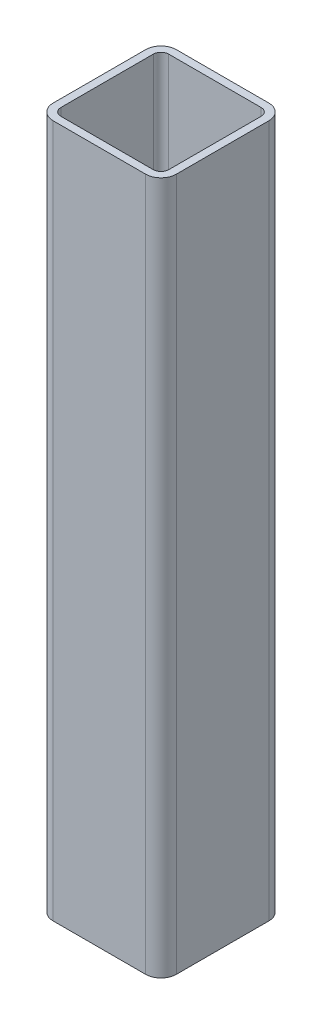
ISO-10303-21;
HEADER;
FILE_DESCRIPTION(('STEP AP214'),'2;1');
FILE_NAME('part.step','',(''),(''),'','','');
FILE_SCHEMA(('AUTOMOTIVE_DESIGN { 1 0 10303 214 1 1 1 1 }'));
ENDSEC;
DATA;
#1=APPLICATION_CONTEXT('core data for automotive mechanical design processes');
#2=APPLICATION_PROTOCOL_DEFINITION('international standard','automotive_design',2000,#1);
#3=PRODUCT_CONTEXT('',#1,'mechanical');
#4=PRODUCT('Part','Part','',(#3));
#5=PRODUCT_RELATED_PRODUCT_CATEGORY('part','',(#4));
#6=PRODUCT_DEFINITION_FORMATION('','',#4);
#7=PRODUCT_DEFINITION_CONTEXT('part definition',#1,'design');
#8=PRODUCT_DEFINITION('design','',#6,#7);
#9=PRODUCT_DEFINITION_SHAPE('','',#8);
#10=(LENGTH_UNIT() NAMED_UNIT(*) SI_UNIT(.MILLI.,.METRE.));
#11=(NAMED_UNIT(*) PLANE_ANGLE_UNIT() SI_UNIT($,.RADIAN.));
#12=(NAMED_UNIT(*) SI_UNIT($,.STERADIAN.) SOLID_ANGLE_UNIT());
#13=UNCERTAINTY_MEASURE_WITH_UNIT(LENGTH_MEASURE(1.E-05),#10,'distance_accuracy_value','');
#14=(GEOMETRIC_REPRESENTATION_CONTEXT(3) GLOBAL_UNCERTAINTY_ASSIGNED_CONTEXT((#13)) GLOBAL_UNIT_ASSIGNED_CONTEXT((#10,
#11,#12)) REPRESENTATION_CONTEXT('',''));
#15=CARTESIAN_POINT('',(0.,0.,0.));
#16=DIRECTION('',(0.,0.,1.));
#17=DIRECTION('',(1.,0.,0.));
#18=AXIS2_PLACEMENT_3D('',#15,#16,#17);
#19=CARTESIAN_POINT('',(70.,450.,-10.));
#20=DIRECTION('',(0.,1.,0.));
#21=DIRECTION('',(0.,0.,1.));
#22=AXIS2_PLACEMENT_3D('',#19,#20,#21);
#23=PLANE('',#22);
#24=CARTESIAN_POINT('',(70.,450.,-10.));
#25=DIRECTION('',(0.,1.,0.));
#26=DIRECTION('',(0.,0.,1.));
#27=AXIS2_PLACEMENT_3D('',#24,#25,#26);
#28=CIRCLE('',#27,10.);
#29=CARTESIAN_POINT('',(69.9999999999999,450.,0.));
#30=VERTEX_POINT('',#29);
#31=CARTESIAN_POINT('',(80.,450.,-10.0000000000001));
#32=VERTEX_POINT('',#31);
#33=EDGE_CURVE('E212',#30,#32,#28,.T.);
#34=ORIENTED_EDGE('',*,*,#33,.T.);
#35=DIRECTION('',(0.,0.,-1.));
#36=VECTOR('',#35,1.);
#37=CARTESIAN_POINT('',(80.,450.,-10.0000000000001));
#38=LINE('',#37,#36);
#39=CARTESIAN_POINT('',(80.,450.,-69.9999999999999));
#40=VERTEX_POINT('',#39);
#41=EDGE_CURVE('E215',#32,#40,#38,.T.);
#42=ORIENTED_EDGE('',*,*,#41,.T.);
#43=CARTESIAN_POINT('',(70.,450.,-70.));
#44=DIRECTION('',(0.,1.,0.));
#45=DIRECTION('',(0.,0.,1.));
#46=AXIS2_PLACEMENT_3D('',#43,#44,#45);
#47=CIRCLE('',#46,10.);
#48=CARTESIAN_POINT('',(69.9999999999999,450.,-80.));
#49=VERTEX_POINT('',#48);
#50=EDGE_CURVE('E218',#40,#49,#47,.T.);
#51=ORIENTED_EDGE('',*,*,#50,.T.);
#52=DIRECTION('',(-1.,0.,0.));
#53=VECTOR('',#52,1.);
#54=CARTESIAN_POINT('',(10.0000000000001,450.,-80.));
#55=LINE('',#54,#53);
#56=CARTESIAN_POINT('',(10.0000000000001,450.,-80.));
#57=VERTEX_POINT('',#56);
#58=EDGE_CURVE('E220',#49,#57,#55,.T.);
#59=ORIENTED_EDGE('',*,*,#58,.T.);
#60=CARTESIAN_POINT('',(10.,450.,-70.));
#61=DIRECTION('',(0.,1.,0.));
#62=DIRECTION('',(0.,0.,1.));
#63=AXIS2_PLACEMENT_3D('',#60,#61,#62);
#64=CIRCLE('',#63,10.);
#65=CARTESIAN_POINT('',(0.,450.,-69.9999999999999));
#66=VERTEX_POINT('',#65);
#67=EDGE_CURVE('E222',#57,#66,#64,.T.);
#68=ORIENTED_EDGE('',*,*,#67,.T.);
#69=DIRECTION('',(0.,0.,1.));
#70=VECTOR('',#69,1.);
#71=CARTESIAN_POINT('',(0.,450.,-10.0000000000001));
#72=LINE('',#71,#70);
#73=CARTESIAN_POINT('',(0.,450.,-10.0000000000001));
#74=VERTEX_POINT('',#73);
#75=EDGE_CURVE('E224',#66,#74,#72,.T.);
#76=ORIENTED_EDGE('',*,*,#75,.T.);
#77=CARTESIAN_POINT('',(10.,450.,-10.));
#78=DIRECTION('',(0.,1.,0.));
#79=DIRECTION('',(0.,0.,1.));
#80=AXIS2_PLACEMENT_3D('',#77,#78,#79);
#81=CIRCLE('',#80,10.);
#82=CARTESIAN_POINT('',(10.0000000000001,450.,0.));
#83=VERTEX_POINT('',#82);
#84=EDGE_CURVE('E226',#74,#83,#81,.T.);
#85=ORIENTED_EDGE('',*,*,#84,.T.);
#86=DIRECTION('',(1.,0.,0.));
#87=VECTOR('',#86,1.);
#88=CARTESIAN_POINT('',(10.0000000000001,450.,0.));
#89=LINE('',#88,#87);
#90=EDGE_CURVE('E228',#83,#30,#89,.T.);
#91=ORIENTED_EDGE('',*,*,#90,.T.);
#92=EDGE_LOOP('',(#34,#42,#51,#59,#68,#76,#85,#91));
#93=FACE_BOUND('',#92,.T.);
#94=DIRECTION('',(1.,0.,0.));
#95=VECTOR('',#94,1.);
#96=CARTESIAN_POINT('',(10.0000000000001,450.,-5.));
#97=LINE('',#96,#95);
#98=CARTESIAN_POINT('',(10.0000000000001,450.,-5.));
#99=VERTEX_POINT('',#98);
#100=CARTESIAN_POINT('',(70.,450.,-5.00000000000001));
#101=VERTEX_POINT('',#100);
#102=EDGE_CURVE('E155',#99,#101,#97,.T.);
#103=ORIENTED_EDGE('',*,*,#102,.F.);
#104=CARTESIAN_POINT('',(10.,450.,-10.));
#105=DIRECTION('',(0.,1.,0.));
#106=DIRECTION('',(0.,0.,1.));
#107=AXIS2_PLACEMENT_3D('',#104,#105,#106);
#108=CIRCLE('',#107,5.);
#109=CARTESIAN_POINT('',(5.,450.,-10.0000000000001));
#110=VERTEX_POINT('',#109);
#111=EDGE_CURVE('E147',#110,#99,#108,.T.);
#112=ORIENTED_EDGE('',*,*,#111,.F.);
#113=DIRECTION('',(0.,0.,1.));
#114=VECTOR('',#113,1.);
#115=CARTESIAN_POINT('',(5.,450.,-10.0000000000001));
#116=LINE('',#115,#114);
#117=CARTESIAN_POINT('',(5.,450.,-69.9999999999999));
#118=VERTEX_POINT('',#117);
#119=EDGE_CURVE('E180',#118,#110,#116,.T.);
#120=ORIENTED_EDGE('',*,*,#119,.F.);
#121=CARTESIAN_POINT('',(10.,450.,-70.));
#122=DIRECTION('',(0.,1.,0.));
#123=DIRECTION('',(0.,0.,1.));
#124=AXIS2_PLACEMENT_3D('',#121,#122,#123);
#125=CIRCLE('',#124,5.);
#126=CARTESIAN_POINT('',(10.,450.,-75.));
#127=VERTEX_POINT('',#126);
#128=EDGE_CURVE('E178',#127,#118,#125,.T.);
#129=ORIENTED_EDGE('',*,*,#128,.F.);
#130=DIRECTION('',(-1.,0.,0.));
#131=VECTOR('',#130,1.);
#132=CARTESIAN_POINT('',(10.,450.,-75.));
#133=LINE('',#132,#131);
#134=CARTESIAN_POINT('',(69.9999999999999,450.,-75.));
#135=VERTEX_POINT('',#134);
#136=EDGE_CURVE('E176',#135,#127,#133,.T.);
#137=ORIENTED_EDGE('',*,*,#136,.F.);
#138=CARTESIAN_POINT('',(70.,450.,-70.));
#139=DIRECTION('',(0.,1.,0.));
#140=DIRECTION('',(0.,0.,1.));
#141=AXIS2_PLACEMENT_3D('',#138,#139,#140);
#142=CIRCLE('',#141,5.00000000000001);
#143=CARTESIAN_POINT('',(75.,450.,-70.));
#144=VERTEX_POINT('',#143);
#145=EDGE_CURVE('E174',#144,#135,#142,.T.);
#146=ORIENTED_EDGE('',*,*,#145,.F.);
#147=DIRECTION('',(0.,0.,-1.));
#148=VECTOR('',#147,1.);
#149=CARTESIAN_POINT('',(75.,450.,-10.0000000000001));
#150=LINE('',#149,#148);
#151=CARTESIAN_POINT('',(75.,450.,-10.0000000000001));
#152=VERTEX_POINT('',#151);
#153=EDGE_CURVE('E170',#152,#144,#150,.T.);
#154=ORIENTED_EDGE('',*,*,#153,.F.);
#155=CARTESIAN_POINT('',(70.,450.,-10.));
#156=DIRECTION('',(0.,1.,0.));
#157=DIRECTION('',(0.,0.,1.));
#158=AXIS2_PLACEMENT_3D('',#155,#156,#157);
#159=CIRCLE('',#158,4.99999999999999);
#160=EDGE_CURVE('E168',#101,#152,#159,.T.);
#161=ORIENTED_EDGE('',*,*,#160,.F.);
#162=EDGE_LOOP('',(#103,#112,#120,#129,#137,#146,#154,#161));
#163=FACE_BOUND('',#162,.T.);
#164=ADVANCED_FACE('F34',(#93,#163),#23,.T.);
#165=CARTESIAN_POINT('',(70.,0.,-10.));
#166=DIRECTION('',(0.,1.,0.));
#167=DIRECTION('',(0.,0.,1.));
#168=AXIS2_PLACEMENT_3D('',#165,#166,#167);
#169=PLANE('',#168);
#170=CARTESIAN_POINT('',(70.,0.,-10.));
#171=DIRECTION('',(0.,1.,0.));
#172=DIRECTION('',(0.,0.,1.));
#173=AXIS2_PLACEMENT_3D('',#170,#171,#172);
#174=CIRCLE('',#173,10.);
#175=CARTESIAN_POINT('',(69.9999999999999,0.,0.));
#176=VERTEX_POINT('',#175);
#177=CARTESIAN_POINT('',(80.,0.,-10.0000000000001));
#178=VERTEX_POINT('',#177);
#179=EDGE_CURVE('E163',#176,#178,#174,.T.);
#180=ORIENTED_EDGE('',*,*,#179,.F.);
#181=DIRECTION('',(1.,0.,0.));
#182=VECTOR('',#181,1.);
#183=CARTESIAN_POINT('',(10.0000000000001,0.,0.));
#184=LINE('',#183,#182);
#185=CARTESIAN_POINT('',(10.0000000000001,0.,0.));
#186=VERTEX_POINT('',#185);
#187=EDGE_CURVE('E216',#186,#176,#184,.T.);
#188=ORIENTED_EDGE('',*,*,#187,.F.);
#189=CARTESIAN_POINT('',(10.,0.,-10.));
#190=DIRECTION('',(0.,1.,0.));
#191=DIRECTION('',(0.,0.,1.));
#192=AXIS2_PLACEMENT_3D('',#189,#190,#191);
#193=CIRCLE('',#192,10.);
#194=CARTESIAN_POINT('',(0.,0.,-10.0000000000001));
#195=VERTEX_POINT('',#194);
#196=EDGE_CURVE('E243',#195,#186,#193,.T.);
#197=ORIENTED_EDGE('',*,*,#196,.F.);
#198=DIRECTION('',(0.,0.,1.));
#199=VECTOR('',#198,1.);
#200=CARTESIAN_POINT('',(0.,0.,-10.0000000000001));
#201=LINE('',#200,#199);
#202=CARTESIAN_POINT('',(0.,0.,-69.9999999999999));
#203=VERTEX_POINT('',#202);
#204=EDGE_CURVE('E241',#203,#195,#201,.T.);
#205=ORIENTED_EDGE('',*,*,#204,.F.);
#206=CARTESIAN_POINT('',(10.,0.,-70.));
#207=DIRECTION('',(0.,1.,0.));
#208=DIRECTION('',(0.,0.,1.));
#209=AXIS2_PLACEMENT_3D('',#206,#207,#208);
#210=CIRCLE('',#209,10.);
#211=CARTESIAN_POINT('',(10.0000000000001,0.,-80.));
#212=VERTEX_POINT('',#211);
#213=EDGE_CURVE('E239',#212,#203,#210,.T.);
#214=ORIENTED_EDGE('',*,*,#213,.F.);
#215=DIRECTION('',(-1.,0.,0.));
#216=VECTOR('',#215,1.);
#217=CARTESIAN_POINT('',(10.0000000000001,0.,-80.));
#218=LINE('',#217,#216);
#219=CARTESIAN_POINT('',(69.9999999999999,0.,-80.));
#220=VERTEX_POINT('',#219);
#221=EDGE_CURVE('E237',#220,#212,#218,.T.);
#222=ORIENTED_EDGE('',*,*,#221,.F.);
#223=CARTESIAN_POINT('',(70.,0.,-70.));
#224=DIRECTION('',(0.,1.,0.));
#225=DIRECTION('',(0.,0.,1.));
#226=AXIS2_PLACEMENT_3D('',#223,#224,#225);
#227=CIRCLE('',#226,10.);
#228=CARTESIAN_POINT('',(80.,0.,-69.9999999999999));
#229=VERTEX_POINT('',#228);
#230=EDGE_CURVE('E235',#229,#220,#227,.T.);
#231=ORIENTED_EDGE('',*,*,#230,.F.);
#232=DIRECTION('',(0.,0.,-1.));
#233=VECTOR('',#232,1.);
#234=CARTESIAN_POINT('',(80.,0.,-10.0000000000001));
#235=LINE('',#234,#233);
#236=EDGE_CURVE('E233',#178,#229,#235,.T.);
#237=ORIENTED_EDGE('',*,*,#236,.F.);
#238=EDGE_LOOP('',(#180,#188,#197,#205,#214,#222,#231,#237));
#239=FACE_BOUND('',#238,.T.);
#240=CARTESIAN_POINT('',(10.,0.,-10.));
#241=DIRECTION('',(0.,1.,0.));
#242=DIRECTION('',(0.,0.,1.));
#243=AXIS2_PLACEMENT_3D('',#240,#241,#242);
#244=CIRCLE('',#243,5.);
#245=CARTESIAN_POINT('',(5.,0.,-10.0000000000001));
#246=VERTEX_POINT('',#245);
#247=CARTESIAN_POINT('',(10.0000000000001,0.,-5.));
#248=VERTEX_POINT('',#247);
#249=EDGE_CURVE('E57',#246,#248,#244,.T.);
#250=ORIENTED_EDGE('',*,*,#249,.T.);
#251=DIRECTION('',(1.,0.,0.));
#252=VECTOR('',#251,1.);
#253=CARTESIAN_POINT('',(10.0000000000001,0.,-5.));
#254=LINE('',#253,#252);
#255=CARTESIAN_POINT('',(70.,0.,-5.00000000000001));
#256=VERTEX_POINT('',#255);
#257=EDGE_CURVE('E162',#248,#256,#254,.T.);
#258=ORIENTED_EDGE('',*,*,#257,.T.);
#259=CARTESIAN_POINT('',(70.,0.,-10.));
#260=DIRECTION('',(0.,1.,0.));
#261=DIRECTION('',(0.,0.,1.));
#262=AXIS2_PLACEMENT_3D('',#259,#260,#261);
#263=CIRCLE('',#262,4.99999999999999);
#264=CARTESIAN_POINT('',(75.,0.,-10.0000000000001));
#265=VERTEX_POINT('',#264);
#266=EDGE_CURVE('E184',#256,#265,#263,.T.);
#267=ORIENTED_EDGE('',*,*,#266,.T.);
#268=DIRECTION('',(0.,0.,-1.));
#269=VECTOR('',#268,1.);
#270=CARTESIAN_POINT('',(75.,0.,-10.0000000000001));
#271=LINE('',#270,#269);
#272=CARTESIAN_POINT('',(75.,0.,-70.));
#273=VERTEX_POINT('',#272);
#274=EDGE_CURVE('E187',#265,#273,#271,.T.);
#275=ORIENTED_EDGE('',*,*,#274,.T.);
#276=CARTESIAN_POINT('',(70.,0.,-70.));
#277=DIRECTION('',(0.,1.,0.));
#278=DIRECTION('',(0.,0.,1.));
#279=AXIS2_PLACEMENT_3D('',#276,#277,#278);
#280=CIRCLE('',#279,5.00000000000001);
#281=CARTESIAN_POINT('',(69.9999999999999,0.,-75.));
#282=VERTEX_POINT('',#281);
#283=EDGE_CURVE('E190',#273,#282,#280,.T.);
#284=ORIENTED_EDGE('',*,*,#283,.T.);
#285=DIRECTION('',(-1.,0.,0.));
#286=VECTOR('',#285,1.);
#287=CARTESIAN_POINT('',(10.,0.,-75.));
#288=LINE('',#287,#286);
#289=CARTESIAN_POINT('',(10.,0.,-75.));
#290=VERTEX_POINT('',#289);
#291=EDGE_CURVE('E193',#282,#290,#288,.T.);
#292=ORIENTED_EDGE('',*,*,#291,.T.);
#293=CARTESIAN_POINT('',(10.,0.,-70.));
#294=DIRECTION('',(0.,1.,0.));
#295=DIRECTION('',(0.,0.,1.));
#296=AXIS2_PLACEMENT_3D('',#293,#294,#295);
#297=CIRCLE('',#296,5.);
#298=CARTESIAN_POINT('',(5.,0.,-69.9999999999999));
#299=VERTEX_POINT('',#298);
#300=EDGE_CURVE('E196',#290,#299,#297,.T.);
#301=ORIENTED_EDGE('',*,*,#300,.T.);
#302=DIRECTION('',(0.,0.,1.));
#303=VECTOR('',#302,1.);
#304=CARTESIAN_POINT('',(5.,0.,-10.0000000000001));
#305=LINE('',#304,#303);
#306=EDGE_CURVE('E156',#299,#246,#305,.T.);
#307=ORIENTED_EDGE('',*,*,#306,.T.);
#308=EDGE_LOOP('',(#250,#258,#267,#275,#284,#292,#301,#307));
#309=FACE_BOUND('',#308,.T.);
#310=ADVANCED_FACE('F273',(#239,#309),#169,.F.);
#311=CARTESIAN_POINT('',(70.,450.,-10.));
#312=DIRECTION('',(0.,-1.,0.));
#313=DIRECTION('',(0.,0.,-1.));
#314=AXIS2_PLACEMENT_3D('',#311,#312,#313);
#315=CYLINDRICAL_SURFACE('',#314,10.);
#316=ORIENTED_EDGE('',*,*,#179,.T.);
#317=DIRECTION('',(0.,-1.,0.));
#318=VECTOR('',#317,1.);
#319=CARTESIAN_POINT('',(80.,450.,-10.0000000000001));
#320=LINE('',#319,#318);
#321=EDGE_CURVE('E11',#32,#178,#320,.T.);
#322=ORIENTED_EDGE('',*,*,#321,.F.);
#323=ORIENTED_EDGE('',*,*,#33,.F.);
#324=DIRECTION('',(0.,-1.,0.));
#325=VECTOR('',#324,1.);
#326=CARTESIAN_POINT('',(69.9999999999999,450.,0.));
#327=LINE('',#326,#325);
#328=EDGE_CURVE('E230',#30,#176,#327,.T.);
#329=ORIENTED_EDGE('',*,*,#328,.T.);
#330=EDGE_LOOP('',(#316,#322,#323,#329));
#331=FACE_BOUND('',#330,.T.);
#332=ADVANCED_FACE('F36',(#331),#315,.T.);
#333=CARTESIAN_POINT('',(80.,450.,-10.0000000000001));
#334=DIRECTION('',(-1.,0.,0.));
#335=DIRECTION('',(0.,0.,1.));
#336=AXIS2_PLACEMENT_3D('',#333,#334,#335);
#337=PLANE('',#336);
#338=ORIENTED_EDGE('',*,*,#236,.T.);
#339=DIRECTION('',(0.,-1.,0.));
#340=VECTOR('',#339,1.);
#341=CARTESIAN_POINT('',(80.,450.,-69.9999999999999));
#342=LINE('',#341,#340);
#343=EDGE_CURVE('E42',#40,#229,#342,.T.);
#344=ORIENTED_EDGE('',*,*,#343,.F.);
#345=ORIENTED_EDGE('',*,*,#41,.F.);
#346=ORIENTED_EDGE('',*,*,#321,.T.);
#347=EDGE_LOOP('',(#338,#344,#345,#346));
#348=FACE_BOUND('',#347,.T.);
#349=ADVANCED_FACE('F290',(#348),#337,.F.);
#350=CARTESIAN_POINT('',(70.,450.,-70.));
#351=DIRECTION('',(0.,-1.,0.));
#352=DIRECTION('',(0.,0.,-1.));
#353=AXIS2_PLACEMENT_3D('',#350,#351,#352);
#354=CYLINDRICAL_SURFACE('',#353,10.);
#355=ORIENTED_EDGE('',*,*,#230,.T.);
#356=DIRECTION('',(0.,-1.,0.));
#357=VECTOR('',#356,1.);
#358=CARTESIAN_POINT('',(69.9999999999999,450.,-80.));
#359=LINE('',#358,#357);
#360=EDGE_CURVE('E260',#49,#220,#359,.T.);
#361=ORIENTED_EDGE('',*,*,#360,.F.);
#362=ORIENTED_EDGE('',*,*,#50,.F.);
#363=ORIENTED_EDGE('',*,*,#343,.T.);
#364=EDGE_LOOP('',(#355,#361,#362,#363));
#365=FACE_BOUND('',#364,.T.);
#366=ADVANCED_FACE('F267',(#365),#354,.T.);
#367=CARTESIAN_POINT('',(10.0000000000001,450.,-80.));
#368=DIRECTION('',(0.,0.,1.));
#369=DIRECTION('',(1.,0.,0.));
#370=AXIS2_PLACEMENT_3D('',#367,#368,#369);
#371=PLANE('',#370);
#372=ORIENTED_EDGE('',*,*,#221,.T.);
#373=DIRECTION('',(0.,-1.,0.));
#374=VECTOR('',#373,1.);
#375=CARTESIAN_POINT('',(10.0000000000001,450.,-80.));
#376=LINE('',#375,#374);
#377=EDGE_CURVE('E257',#57,#212,#376,.T.);
#378=ORIENTED_EDGE('',*,*,#377,.F.);
#379=ORIENTED_EDGE('',*,*,#58,.F.);
#380=ORIENTED_EDGE('',*,*,#360,.T.);
#381=EDGE_LOOP('',(#372,#378,#379,#380));
#382=FACE_BOUND('',#381,.T.);
#383=ADVANCED_FACE('F279',(#382),#371,.F.);
#384=CARTESIAN_POINT('',(10.,450.,-70.));
#385=DIRECTION('',(0.,-1.,0.));
#386=DIRECTION('',(0.,0.,-1.));
#387=AXIS2_PLACEMENT_3D('',#384,#385,#386);
#388=CYLINDRICAL_SURFACE('',#387,10.);
#389=ORIENTED_EDGE('',*,*,#213,.T.);
#390=DIRECTION('',(0.,-1.,0.));
#391=VECTOR('',#390,1.);
#392=CARTESIAN_POINT('',(0.,450.,-69.9999999999999));
#393=LINE('',#392,#391);
#394=EDGE_CURVE('E254',#66,#203,#393,.T.);
#395=ORIENTED_EDGE('',*,*,#394,.F.);
#396=ORIENTED_EDGE('',*,*,#67,.F.);
#397=ORIENTED_EDGE('',*,*,#377,.T.);
#398=EDGE_LOOP('',(#389,#395,#396,#397));
#399=FACE_BOUND('',#398,.T.);
#400=ADVANCED_FACE('F283',(#399),#388,.T.);
#401=CARTESIAN_POINT('',(0.,450.,-10.0000000000001));
#402=DIRECTION('',(1.,0.,0.));
#403=DIRECTION('',(0.,0.,-1.));
#404=AXIS2_PLACEMENT_3D('',#401,#402,#403);
#405=PLANE('',#404);
#406=ORIENTED_EDGE('',*,*,#204,.T.);
#407=DIRECTION('',(0.,-1.,0.));
#408=VECTOR('',#407,1.);
#409=CARTESIAN_POINT('',(0.,450.,-10.0000000000001));
#410=LINE('',#409,#408);
#411=EDGE_CURVE('E251',#74,#195,#410,.T.);
#412=ORIENTED_EDGE('',*,*,#411,.F.);
#413=ORIENTED_EDGE('',*,*,#75,.F.);
#414=ORIENTED_EDGE('',*,*,#394,.T.);
#415=EDGE_LOOP('',(#406,#412,#413,#414));
#416=FACE_BOUND('',#415,.T.);
#417=ADVANCED_FACE('F303',(#416),#405,.F.);
#418=CARTESIAN_POINT('',(10.,450.,-10.));
#419=DIRECTION('',(0.,-1.,0.));
#420=DIRECTION('',(0.,0.,-1.));
#421=AXIS2_PLACEMENT_3D('',#418,#419,#420);
#422=CYLINDRICAL_SURFACE('',#421,10.);
#423=ORIENTED_EDGE('',*,*,#196,.T.);
#424=DIRECTION('',(0.,-1.,0.));
#425=VECTOR('',#424,1.);
#426=CARTESIAN_POINT('',(10.0000000000001,450.,0.));
#427=LINE('',#426,#425);
#428=EDGE_CURVE('E248',#83,#186,#427,.T.);
#429=ORIENTED_EDGE('',*,*,#428,.F.);
#430=ORIENTED_EDGE('',*,*,#84,.F.);
#431=ORIENTED_EDGE('',*,*,#411,.T.);
#432=EDGE_LOOP('',(#423,#429,#430,#431));
#433=FACE_BOUND('',#432,.T.);
#434=ADVANCED_FACE('F301',(#433),#422,.T.);
#435=CARTESIAN_POINT('',(10.0000000000001,450.,0.));
#436=DIRECTION('',(0.,0.,-1.));
#437=DIRECTION('',(-1.,0.,0.));
#438=AXIS2_PLACEMENT_3D('',#435,#436,#437);
#439=PLANE('',#438);
#440=ORIENTED_EDGE('',*,*,#187,.T.);
#441=ORIENTED_EDGE('',*,*,#328,.F.);
#442=ORIENTED_EDGE('',*,*,#90,.F.);
#443=ORIENTED_EDGE('',*,*,#428,.T.);
#444=EDGE_LOOP('',(#440,#441,#442,#443));
#445=FACE_BOUND('',#444,.T.);
#446=ADVANCED_FACE('F296',(#445),#439,.F.);
#447=CARTESIAN_POINT('',(10.,450.,-10.));
#448=DIRECTION('',(0.,-1.,0.));
#449=DIRECTION('',(0.,0.,-1.));
#450=AXIS2_PLACEMENT_3D('',#447,#448,#449);
#451=CYLINDRICAL_SURFACE('',#450,5.);
#452=ORIENTED_EDGE('',*,*,#249,.F.);
#453=DIRECTION('',(0.,-1.,0.));
#454=VECTOR('',#453,1.);
#455=CARTESIAN_POINT('',(5.,450.,-10.0000000000001));
#456=LINE('',#455,#454);
#457=EDGE_CURVE('E151',#110,#246,#456,.T.);
#458=ORIENTED_EDGE('',*,*,#457,.F.);
#459=ORIENTED_EDGE('',*,*,#111,.T.);
#460=DIRECTION('',(0.,-1.,0.));
#461=VECTOR('',#460,1.);
#462=CARTESIAN_POINT('',(10.0000000000001,450.,-5.));
#463=LINE('',#462,#461);
#464=EDGE_CURVE('E150',#99,#248,#463,.T.);
#465=ORIENTED_EDGE('',*,*,#464,.T.);
#466=EDGE_LOOP('',(#452,#458,#459,#465));
#467=FACE_BOUND('',#466,.T.);
#468=ADVANCED_FACE('F149',(#467),#451,.F.);
#469=CARTESIAN_POINT('',(10.0000000000001,450.,-5.));
#470=DIRECTION('',(0.,0.,-1.));
#471=DIRECTION('',(-1.,0.,0.));
#472=AXIS2_PLACEMENT_3D('',#469,#470,#471);
#473=PLANE('',#472);
#474=ORIENTED_EDGE('',*,*,#257,.F.);
#475=ORIENTED_EDGE('',*,*,#464,.F.);
#476=ORIENTED_EDGE('',*,*,#102,.T.);
#477=DIRECTION('',(0.,-1.,0.));
#478=VECTOR('',#477,1.);
#479=CARTESIAN_POINT('',(70.,450.,-5.00000000000001));
#480=LINE('',#479,#478);
#481=EDGE_CURVE('E164',#101,#256,#480,.T.);
#482=ORIENTED_EDGE('',*,*,#481,.T.);
#483=EDGE_LOOP('',(#474,#475,#476,#482));
#484=FACE_BOUND('',#483,.T.);
#485=ADVANCED_FACE('F159',(#484),#473,.T.);
#486=CARTESIAN_POINT('',(70.,450.,-10.));
#487=DIRECTION('',(0.,-1.,0.));
#488=DIRECTION('',(0.,0.,-1.));
#489=AXIS2_PLACEMENT_3D('',#486,#487,#488);
#490=CYLINDRICAL_SURFACE('',#489,4.99999999999999);
#491=ORIENTED_EDGE('',*,*,#266,.F.);
#492=ORIENTED_EDGE('',*,*,#481,.F.);
#493=ORIENTED_EDGE('',*,*,#160,.T.);
#494=DIRECTION('',(0.,-1.,0.));
#495=VECTOR('',#494,1.);
#496=CARTESIAN_POINT('',(75.,450.,-10.0000000000001));
#497=LINE('',#496,#495);
#498=EDGE_CURVE('E209',#152,#265,#497,.T.);
#499=ORIENTED_EDGE('',*,*,#498,.T.);
#500=EDGE_LOOP('',(#491,#492,#493,#499));
#501=FACE_BOUND('',#500,.T.);
#502=ADVANCED_FACE('F328',(#501),#490,.F.);
#503=CARTESIAN_POINT('',(75.,450.,-10.0000000000001));
#504=DIRECTION('',(-1.,0.,0.));
#505=DIRECTION('',(0.,0.,1.));
#506=AXIS2_PLACEMENT_3D('',#503,#504,#505);
#507=PLANE('',#506);
#508=ORIENTED_EDGE('',*,*,#274,.F.);
#509=ORIENTED_EDGE('',*,*,#498,.F.);
#510=ORIENTED_EDGE('',*,*,#153,.T.);
#511=DIRECTION('',(0.,-1.,0.));
#512=VECTOR('',#511,1.);
#513=CARTESIAN_POINT('',(75.,450.,-70.));
#514=LINE('',#513,#512);
#515=EDGE_CURVE('E207',#144,#273,#514,.T.);
#516=ORIENTED_EDGE('',*,*,#515,.T.);
#517=EDGE_LOOP('',(#508,#509,#510,#516));
#518=FACE_BOUND('',#517,.T.);
#519=ADVANCED_FACE('F332',(#518),#507,.T.);
#520=CARTESIAN_POINT('',(70.,450.,-70.));
#521=DIRECTION('',(0.,-1.,0.));
#522=DIRECTION('',(0.,0.,-1.));
#523=AXIS2_PLACEMENT_3D('',#520,#521,#522);
#524=CYLINDRICAL_SURFACE('',#523,5.00000000000001);
#525=ORIENTED_EDGE('',*,*,#283,.F.);
#526=ORIENTED_EDGE('',*,*,#515,.F.);
#527=ORIENTED_EDGE('',*,*,#145,.T.);
#528=DIRECTION('',(0.,-1.,0.));
#529=VECTOR('',#528,1.);
#530=CARTESIAN_POINT('',(69.9999999999999,450.,-75.));
#531=LINE('',#530,#529);
#532=EDGE_CURVE('E205',#135,#282,#531,.T.);
#533=ORIENTED_EDGE('',*,*,#532,.T.);
#534=EDGE_LOOP('',(#525,#526,#527,#533));
#535=FACE_BOUND('',#534,.T.);
#536=ADVANCED_FACE('F338',(#535),#524,.F.);
#537=CARTESIAN_POINT('',(10.,450.,-75.));
#538=DIRECTION('',(0.,0.,1.));
#539=DIRECTION('',(1.,0.,0.));
#540=AXIS2_PLACEMENT_3D('',#537,#538,#539);
#541=PLANE('',#540);
#542=ORIENTED_EDGE('',*,*,#291,.F.);
#543=ORIENTED_EDGE('',*,*,#532,.F.);
#544=ORIENTED_EDGE('',*,*,#136,.T.);
#545=DIRECTION('',(0.,-1.,0.));
#546=VECTOR('',#545,1.);
#547=CARTESIAN_POINT('',(10.,450.,-75.));
#548=LINE('',#547,#546);
#549=EDGE_CURVE('E203',#127,#290,#548,.T.);
#550=ORIENTED_EDGE('',*,*,#549,.T.);
#551=EDGE_LOOP('',(#542,#543,#544,#550));
#552=FACE_BOUND('',#551,.T.);
#553=ADVANCED_FACE('F342',(#552),#541,.T.);
#554=CARTESIAN_POINT('',(10.,450.,-70.));
#555=DIRECTION('',(0.,-1.,0.));
#556=DIRECTION('',(0.,0.,-1.));
#557=AXIS2_PLACEMENT_3D('',#554,#555,#556);
#558=CYLINDRICAL_SURFACE('',#557,5.);
#559=ORIENTED_EDGE('',*,*,#300,.F.);
#560=ORIENTED_EDGE('',*,*,#549,.F.);
#561=ORIENTED_EDGE('',*,*,#128,.T.);
#562=DIRECTION('',(0.,-1.,0.));
#563=VECTOR('',#562,1.);
#564=CARTESIAN_POINT('',(5.,450.,-69.9999999999999));
#565=LINE('',#564,#563);
#566=EDGE_CURVE('E49',#118,#299,#565,.T.);
#567=ORIENTED_EDGE('',*,*,#566,.T.);
#568=EDGE_LOOP('',(#559,#560,#561,#567));
#569=FACE_BOUND('',#568,.T.);
#570=ADVANCED_FACE('F346',(#569),#558,.F.);
#571=CARTESIAN_POINT('',(5.,450.,-10.0000000000001));
#572=DIRECTION('',(1.,0.,0.));
#573=DIRECTION('',(0.,0.,-1.));
#574=AXIS2_PLACEMENT_3D('',#571,#572,#573);
#575=PLANE('',#574);
#576=ORIENTED_EDGE('',*,*,#306,.F.);
#577=ORIENTED_EDGE('',*,*,#566,.F.);
#578=ORIENTED_EDGE('',*,*,#119,.T.);
#579=ORIENTED_EDGE('',*,*,#457,.T.);
#580=EDGE_LOOP('',(#576,#577,#578,#579));
#581=FACE_BOUND('',#580,.T.);
#582=ADVANCED_FACE('F350',(#581),#575,.T.);
#583=CLOSED_SHELL('',(#164,#310,#332,#349,#366,#383,#400,#417,#434,#446,#468,#485,#502,#519,
#536,#553,#570,#582));
#584=MANIFOLD_SOLID_BREP('B2',#583);
#585=ADVANCED_BREP_SHAPE_REPRESENTATION('',(#18,#584),#14);
#586=SHAPE_DEFINITION_REPRESENTATION(#9,#585);
ENDSEC;
END-ISO-10303-21;
